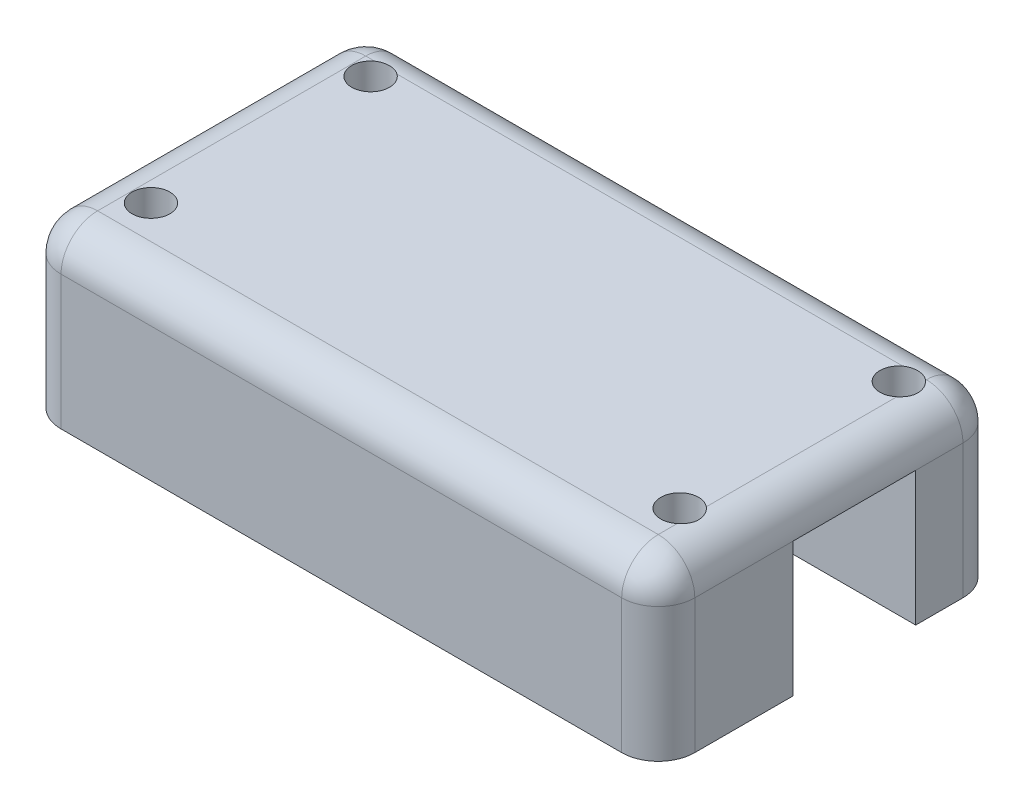
ISO-10303-21;
HEADER;
FILE_DESCRIPTION(('STEP AP214'),'2;1');
FILE_NAME('part.step','',(''),(''),'','','');
FILE_SCHEMA(('AUTOMOTIVE_DESIGN { 1 0 10303 214 1 1 1 1 }'));
ENDSEC;
DATA;
#1=APPLICATION_CONTEXT('core data for automotive mechanical design processes');
#2=APPLICATION_PROTOCOL_DEFINITION('international standard','automotive_design',2000,#1);
#3=PRODUCT_CONTEXT('',#1,'mechanical');
#4=PRODUCT('Part','Part','',(#3));
#5=PRODUCT_RELATED_PRODUCT_CATEGORY('part','',(#4));
#6=PRODUCT_DEFINITION_FORMATION('','',#4);
#7=PRODUCT_DEFINITION_CONTEXT('part definition',#1,'design');
#8=PRODUCT_DEFINITION('design','',#6,#7);
#9=PRODUCT_DEFINITION_SHAPE('','',#8);
#10=(LENGTH_UNIT() NAMED_UNIT(*) SI_UNIT(.MILLI.,.METRE.));
#11=(NAMED_UNIT(*) PLANE_ANGLE_UNIT() SI_UNIT($,.RADIAN.));
#12=(NAMED_UNIT(*) SI_UNIT($,.STERADIAN.) SOLID_ANGLE_UNIT());
#13=UNCERTAINTY_MEASURE_WITH_UNIT(LENGTH_MEASURE(1.E-05),#10,'distance_accuracy_value','');
#14=(GEOMETRIC_REPRESENTATION_CONTEXT(3) GLOBAL_UNCERTAINTY_ASSIGNED_CONTEXT((#13)) GLOBAL_UNIT_ASSIGNED_CONTEXT((#10,
#11,#12)) REPRESENTATION_CONTEXT('',''));
#15=CARTESIAN_POINT('',(0.,0.,0.));
#16=DIRECTION('',(0.,0.,1.));
#17=DIRECTION('',(1.,0.,0.));
#18=AXIS2_PLACEMENT_3D('',#15,#16,#17);
#19=CARTESIAN_POINT('',(26.,14.,-14.));
#20=DIRECTION('',(-1.,0.,0.));
#21=DIRECTION('',(0.,0.,1.));
#22=AXIS2_PLACEMENT_3D('',#19,#20,#21);
#23=PLANE('',#22);
#24=DIRECTION('',(0.,0.,-1.));
#25=VECTOR('',#24,1.);
#26=CARTESIAN_POINT('',(26.,0.,-14.));
#27=LINE('',#26,#25);
#28=CARTESIAN_POINT('',(26.,0.,-7.12499999999999));
#29=VERTEX_POINT('',#28);
#30=CARTESIAN_POINT('',(26.,0.,-11.));
#31=VERTEX_POINT('',#30);
#32=EDGE_CURVE('E182',#29,#31,#27,.T.);
#33=ORIENTED_EDGE('',*,*,#32,.T.);
#34=DIRECTION('',(0.,-1.,0.));
#35=VECTOR('',#34,1.);
#36=CARTESIAN_POINT('',(26.,14.,-11.));
#37=LINE('',#36,#35);
#38=CARTESIAN_POINT('',(26.,11.,-11.));
#39=VERTEX_POINT('',#38);
#40=EDGE_CURVE('E51',#31,#39,#37,.F.);
#41=ORIENTED_EDGE('',*,*,#40,.T.);
#42=DIRECTION('',(0.,0.,-1.));
#43=VECTOR('',#42,1.);
#44=CARTESIAN_POINT('',(26.,11.,14.));
#45=LINE('',#44,#43);
#46=CARTESIAN_POINT('',(26.,11.,-7.12499999999999));
#47=VERTEX_POINT('',#46);
#48=EDGE_CURVE('E495',#39,#47,#45,.F.);
#49=ORIENTED_EDGE('',*,*,#48,.T.);
#50=DIRECTION('',(0.,-1.,0.));
#51=VECTOR('',#50,1.);
#52=CARTESIAN_POINT('',(26.,14.,-7.12499999999999));
#53=LINE('',#52,#51);
#54=EDGE_CURVE('E193',#47,#29,#53,.T.);
#55=ORIENTED_EDGE('',*,*,#54,.T.);
#56=EDGE_LOOP('',(#33,#41,#49,#55));
#57=FACE_BOUND('',#56,.T.);
#58=ADVANCED_FACE('F41',(#57),#23,.F.);
#59=CARTESIAN_POINT('',(-26.,14.,-14.));
#60=DIRECTION('',(1.,0.,0.));
#61=DIRECTION('',(0.,0.,-1.));
#62=AXIS2_PLACEMENT_3D('',#59,#60,#61);
#63=PLANE('',#62);
#64=DIRECTION('',(0.,0.,1.));
#65=VECTOR('',#64,1.);
#66=CARTESIAN_POINT('',(-26.,0.,-14.));
#67=LINE('',#66,#65);
#68=CARTESIAN_POINT('',(-26.,0.,2.925));
#69=VERTEX_POINT('',#68);
#70=CARTESIAN_POINT('',(-26.,0.,11.));
#71=VERTEX_POINT('',#70);
#72=EDGE_CURVE('E201',#69,#71,#67,.T.);
#73=ORIENTED_EDGE('',*,*,#72,.T.);
#74=DIRECTION('',(0.,-1.,0.));
#75=VECTOR('',#74,1.);
#76=CARTESIAN_POINT('',(-26.,14.,11.));
#77=LINE('',#76,#75);
#78=CARTESIAN_POINT('',(-26.,11.,11.));
#79=VERTEX_POINT('',#78);
#80=EDGE_CURVE('E448',#71,#79,#77,.F.);
#81=ORIENTED_EDGE('',*,*,#80,.T.);
#82=DIRECTION('',(0.,0.,1.));
#83=VECTOR('',#82,1.);
#84=CARTESIAN_POINT('',(-26.,11.,-14.));
#85=LINE('',#84,#83);
#86=CARTESIAN_POINT('',(-26.,11.,2.925));
#87=VERTEX_POINT('',#86);
#88=EDGE_CURVE('E305',#79,#87,#85,.F.);
#89=ORIENTED_EDGE('',*,*,#88,.T.);
#90=DIRECTION('',(0.,-1.,0.));
#91=VECTOR('',#90,1.);
#92=CARTESIAN_POINT('',(-26.,14.,2.92500000000001));
#93=LINE('',#92,#91);
#94=EDGE_CURVE('E266',#87,#69,#93,.T.);
#95=ORIENTED_EDGE('',*,*,#94,.T.);
#96=EDGE_LOOP('',(#73,#81,#89,#95));
#97=FACE_BOUND('',#96,.T.);
#98=ADVANCED_FACE('F381',(#97),#63,.F.);
#99=CARTESIAN_POINT('',(0.,14.,0.));
#100=DIRECTION('',(0.,1.,0.));
#101=DIRECTION('',(0.,0.,1.));
#102=AXIS2_PLACEMENT_3D('',#99,#100,#101);
#103=PLANE('',#102);
#104=CARTESIAN_POINT('',(-21.3724903036261,14.,8.24998775653111));
#105=DIRECTION('',(0.,1.,0.));
#106=DIRECTION('',(0.,0.,1.));
#107=AXIS2_PLACEMENT_3D('',#104,#105,#106);
#108=CIRCLE('',#107,1.55);
#109=CARTESIAN_POINT('',(-21.3724903036261,14.,9.79998775653111));
#110=VERTEX_POINT('',#109);
#111=EDGE_CURVE('E247',#110,#110,#108,.T.);
#112=ORIENTED_EDGE('',*,*,#111,.F.);
#113=EDGE_LOOP('',(#112));
#114=FACE_BOUND('',#113,.T.);
#115=CARTESIAN_POINT('',(21.9892542467683,14.,-9.74999999999796));
#116=DIRECTION('',(0.,1.,0.));
#117=DIRECTION('',(0.,0.,1.));
#118=AXIS2_PLACEMENT_3D('',#115,#116,#117);
#119=CIRCLE('',#118,1.55);
#120=CARTESIAN_POINT('',(21.0727391077799,14.,-11.));
#121=VERTEX_POINT('',#120);
#122=CARTESIAN_POINT('',(23.,14.,-8.57488595347992));
#123=VERTEX_POINT('',#122);
#124=EDGE_CURVE('E222',#121,#123,#119,.T.);
#125=ORIENTED_EDGE('',*,*,#124,.F.);
#126=DIRECTION('',(-1.,0.,0.));
#127=VECTOR('',#126,1.);
#128=CARTESIAN_POINT('',(-26.,14.,-11.));
#129=LINE('',#128,#127);
#130=CARTESIAN_POINT('',(-20.4349807652959,14.,-11.));
#131=VERTEX_POINT('',#130);
#132=EDGE_CURVE('E298',#121,#131,#129,.T.);
#133=ORIENTED_EDGE('',*,*,#132,.T.);
#134=CARTESIAN_POINT('',(-21.3514959042843,14.,-9.74999999999796));
#135=DIRECTION('',(0.,1.,0.));
#136=DIRECTION('',(0.,0.,1.));
#137=AXIS2_PLACEMENT_3D('',#134,#135,#136);
#138=CIRCLE('',#137,1.55);
#139=CARTESIAN_POINT('',(-22.2680110432727,14.,-11.));
#140=VERTEX_POINT('',#139);
#141=EDGE_CURVE('E230',#140,#131,#138,.T.);
#142=ORIENTED_EDGE('',*,*,#141,.F.);
#143=DIRECTION('',(-1.,0.,0.));
#144=VECTOR('',#143,1.);
#145=CARTESIAN_POINT('',(-26.,14.,-11.));
#146=LINE('',#145,#144);
#147=CARTESIAN_POINT('',(-23.,14.,-11.));
#148=VERTEX_POINT('',#147);
#149=EDGE_CURVE('E284',#140,#148,#146,.T.);
#150=ORIENTED_EDGE('',*,*,#149,.T.);
#151=DIRECTION('',(0.,0.,1.));
#152=VECTOR('',#151,1.);
#153=CARTESIAN_POINT('',(-23.,14.,14.));
#154=LINE('',#153,#152);
#155=CARTESIAN_POINT('',(-23.,14.,11.));
#156=VERTEX_POINT('',#155);
#157=EDGE_CURVE('E280',#148,#156,#154,.T.);
#158=ORIENTED_EDGE('',*,*,#157,.T.);
#159=DIRECTION('',(1.,0.,0.));
#160=VECTOR('',#159,1.);
#161=CARTESIAN_POINT('',(26.,14.,11.));
#162=LINE('',#161,#160);
#163=CARTESIAN_POINT('',(23.,14.,11.));
#164=VERTEX_POINT('',#163);
#165=EDGE_CURVE('E273',#156,#164,#162,.T.);
#166=ORIENTED_EDGE('',*,*,#165,.T.);
#167=DIRECTION('',(0.,0.,-1.));
#168=VECTOR('',#167,1.);
#169=CARTESIAN_POINT('',(23.,14.,-14.));
#170=LINE('',#169,#168);
#171=CARTESIAN_POINT('',(23.,14.,9.44283823227111));
#172=VERTEX_POINT('',#171);
#173=EDGE_CURVE('E277',#164,#172,#170,.T.);
#174=ORIENTED_EDGE('',*,*,#173,.T.);
#175=CARTESIAN_POINT('',(22.0102486461101,14.,8.24998775653111));
#176=DIRECTION('',(0.,1.,0.));
#177=DIRECTION('',(0.,0.,1.));
#178=AXIS2_PLACEMENT_3D('',#175,#176,#177);
#179=CIRCLE('',#178,1.55);
#180=CARTESIAN_POINT('',(23.,14.,7.05713728079111));
#181=VERTEX_POINT('',#180);
#182=EDGE_CURVE('E239',#181,#172,#179,.T.);
#183=ORIENTED_EDGE('',*,*,#182,.F.);
#184=DIRECTION('',(0.,0.,-1.));
#185=VECTOR('',#184,1.);
#186=CARTESIAN_POINT('',(23.,14.,-14.));
#187=LINE('',#186,#185);
#188=EDGE_CURVE('E295',#181,#123,#187,.T.);
#189=ORIENTED_EDGE('',*,*,#188,.T.);
#190=EDGE_LOOP('',(#125,#133,#142,#150,#158,#166,#174,#183,#189));
#191=FACE_BOUND('',#190,.T.);
#192=ADVANCED_FACE('F370',(#114,#191),#103,.T.);
#193=CARTESIAN_POINT('',(0.,0.,0.));
#194=DIRECTION('',(0.,1.,0.));
#195=DIRECTION('',(0.,0.,1.));
#196=AXIS2_PLACEMENT_3D('',#193,#194,#195);
#197=PLANE('',#196);
#198=CARTESIAN_POINT('',(21.9892542467683,0.,-9.74999999999796));
#199=DIRECTION('',(0.,1.,0.));
#200=DIRECTION('',(0.,0.,1.));
#201=AXIS2_PLACEMENT_3D('',#198,#199,#200);
#202=CIRCLE('',#201,1.55);
#203=CARTESIAN_POINT('',(21.9892542467683,0.,-8.19999999999796));
#204=VERTEX_POINT('',#203);
#205=EDGE_CURVE('E221',#204,#204,#202,.T.);
#206=ORIENTED_EDGE('',*,*,#205,.T.);
#207=EDGE_LOOP('',(#206));
#208=FACE_BOUND('',#207,.T.);
#209=CARTESIAN_POINT('',(-21.3514959042843,0.,-9.74999999999796));
#210=DIRECTION('',(0.,1.,0.));
#211=DIRECTION('',(0.,0.,1.));
#212=AXIS2_PLACEMENT_3D('',#209,#210,#211);
#213=CIRCLE('',#212,1.55);
#214=CARTESIAN_POINT('',(-21.3514959042843,0.,-8.19999999999796));
#215=VERTEX_POINT('',#214);
#216=EDGE_CURVE('E235',#215,#215,#213,.T.);
#217=ORIENTED_EDGE('',*,*,#216,.T.);
#218=EDGE_LOOP('',(#217));
#219=FACE_BOUND('',#218,.T.);
#220=CARTESIAN_POINT('',(-26.,0.,-11.));
#221=VERTEX_POINT('',#220);
#222=CARTESIAN_POINT('',(-26.,0.,-7.12499999999999));
#223=VERTEX_POINT('',#222);
#224=EDGE_CURVE('E256',#221,#223,#67,.T.);
#225=ORIENTED_EDGE('',*,*,#224,.F.);
#226=CARTESIAN_POINT('',(-23.,0.,-11.));
#227=DIRECTION('',(0.,1.,0.));
#228=DIRECTION('',(0.,0.,1.));
#229=AXIS2_PLACEMENT_3D('',#226,#227,#228);
#230=CIRCLE('',#229,3.);
#231=CARTESIAN_POINT('',(-23.,0.,-14.));
#232=VERTEX_POINT('',#231);
#233=EDGE_CURVE('E59',#221,#232,#230,.F.);
#234=ORIENTED_EDGE('',*,*,#233,.T.);
#235=DIRECTION('',(-1.,0.,0.));
#236=VECTOR('',#235,1.);
#237=CARTESIAN_POINT('',(-26.,0.,-14.));
#238=LINE('',#237,#236);
#239=CARTESIAN_POINT('',(23.,0.,-14.));
#240=VERTEX_POINT('',#239);
#241=EDGE_CURVE('E181',#240,#232,#238,.T.);
#242=ORIENTED_EDGE('',*,*,#241,.F.);
#243=CARTESIAN_POINT('',(23.,0.,-11.));
#244=DIRECTION('',(0.,1.,0.));
#245=DIRECTION('',(0.,0.,1.));
#246=AXIS2_PLACEMENT_3D('',#243,#244,#245);
#247=CIRCLE('',#246,3.);
#248=EDGE_CURVE('E415',#240,#31,#247,.F.);
#249=ORIENTED_EDGE('',*,*,#248,.T.);
#250=ORIENTED_EDGE('',*,*,#32,.F.);
#251=DIRECTION('',(1.,0.,0.));
#252=VECTOR('',#251,1.);
#253=CARTESIAN_POINT('',(-31.3177772836356,0.,-7.12499999999999));
#254=LINE('',#253,#252);
#255=EDGE_CURVE('E203',#223,#29,#254,.T.);
#256=ORIENTED_EDGE('',*,*,#255,.F.);
#257=EDGE_LOOP('',(#225,#234,#242,#249,#250,#256));
#258=FACE_BOUND('',#257,.T.);
#259=ADVANCED_FACE('F368',(#208,#219,#258),#197,.F.);
#260=DIRECTION('',(0.,0.,-1.));
#261=VECTOR('',#260,1.);
#262=CARTESIAN_POINT('',(23.,14.,-14.));
#263=LINE('',#262,#261);
#264=CARTESIAN_POINT('',(23.,14.,-10.925114046516));
#265=VERTEX_POINT('',#264);
#266=CARTESIAN_POINT('',(23.,14.,-11.));
#267=VERTEX_POINT('',#266);
#268=EDGE_CURVE('E288',#265,#267,#263,.T.);
#269=ORIENTED_EDGE('',*,*,#268,.T.);
#270=DIRECTION('',(-1.,0.,0.));
#271=VECTOR('',#270,1.);
#272=CARTESIAN_POINT('',(-26.,14.,-11.));
#273=LINE('',#272,#271);
#274=CARTESIAN_POINT('',(22.9057693857566,14.,-11.));
#275=VERTEX_POINT('',#274);
#276=EDGE_CURVE('E292',#267,#275,#273,.T.);
#277=ORIENTED_EDGE('',*,*,#276,.T.);
#278=EDGE_CURVE('E226',#265,#275,#119,.T.);
#279=ORIENTED_EDGE('',*,*,#278,.F.);
#280=EDGE_LOOP('',(#269,#277,#279));
#281=FACE_BOUND('',#280,.T.);
#282=ADVANCED_FACE('F365',(#281),#103,.T.);
#283=DIRECTION('',(1.,0.,0.));
#284=VECTOR('',#283,1.);
#285=CARTESIAN_POINT('',(-26.,0.,14.));
#286=LINE('',#285,#284);
#287=CARTESIAN_POINT('',(-23.,0.,14.));
#288=VERTEX_POINT('',#287);
#289=CARTESIAN_POINT('',(23.,0.,14.));
#290=VERTEX_POINT('',#289);
#291=EDGE_CURVE('E259',#288,#290,#286,.T.);
#292=ORIENTED_EDGE('',*,*,#291,.F.);
#293=CARTESIAN_POINT('',(-23.,0.,11.));
#294=DIRECTION('',(0.,1.,0.));
#295=DIRECTION('',(0.,0.,1.));
#296=AXIS2_PLACEMENT_3D('',#293,#294,#295);
#297=CIRCLE('',#296,3.);
#298=EDGE_CURVE('E443',#288,#71,#297,.F.);
#299=ORIENTED_EDGE('',*,*,#298,.T.);
#300=ORIENTED_EDGE('',*,*,#72,.F.);
#301=DIRECTION('',(-1.,0.,0.));
#302=VECTOR('',#301,1.);
#303=CARTESIAN_POINT('',(-31.3177772836356,0.,2.925));
#304=LINE('',#303,#302);
#305=CARTESIAN_POINT('',(26.,0.,2.925));
#306=VERTEX_POINT('',#305);
#307=EDGE_CURVE('E188',#306,#69,#304,.T.);
#308=ORIENTED_EDGE('',*,*,#307,.F.);
#309=CARTESIAN_POINT('',(26.,0.,11.));
#310=VERTEX_POINT('',#309);
#311=EDGE_CURVE('E170',#310,#306,#27,.T.);
#312=ORIENTED_EDGE('',*,*,#311,.F.);
#313=CARTESIAN_POINT('',(23.,0.,11.));
#314=DIRECTION('',(0.,1.,0.));
#315=DIRECTION('',(0.,0.,1.));
#316=AXIS2_PLACEMENT_3D('',#313,#314,#315);
#317=CIRCLE('',#316,3.);
#318=EDGE_CURVE('E441',#310,#290,#317,.F.);
#319=ORIENTED_EDGE('',*,*,#318,.T.);
#320=EDGE_LOOP('',(#292,#299,#300,#308,#312,#319));
#321=FACE_BOUND('',#320,.T.);
#322=CARTESIAN_POINT('',(-21.3724903036261,0.,8.24998775653111));
#323=DIRECTION('',(0.,1.,0.));
#324=DIRECTION('',(0.,0.,1.));
#325=AXIS2_PLACEMENT_3D('',#322,#323,#324);
#326=CIRCLE('',#325,1.55);
#327=CARTESIAN_POINT('',(-21.3724903036261,0.,9.79998775653111));
#328=VERTEX_POINT('',#327);
#329=EDGE_CURVE('E243',#328,#328,#326,.T.);
#330=ORIENTED_EDGE('',*,*,#329,.T.);
#331=EDGE_LOOP('',(#330));
#332=FACE_BOUND('',#331,.T.);
#333=CARTESIAN_POINT('',(22.0102486461101,0.,8.24998775653111));
#334=DIRECTION('',(0.,1.,0.));
#335=DIRECTION('',(0.,0.,1.));
#336=AXIS2_PLACEMENT_3D('',#333,#334,#335);
#337=CIRCLE('',#336,1.55);
#338=CARTESIAN_POINT('',(22.0102486461101,0.,9.79998775653111));
#339=VERTEX_POINT('',#338);
#340=EDGE_CURVE('E234',#339,#339,#337,.T.);
#341=ORIENTED_EDGE('',*,*,#340,.T.);
#342=EDGE_LOOP('',(#341));
#343=FACE_BOUND('',#342,.T.);
#344=ADVANCED_FACE('F198',(#321,#332,#343),#197,.F.);
#345=DIRECTION('',(0.,0.,-1.));
#346=VECTOR('',#345,1.);
#347=CARTESIAN_POINT('',(26.,11.,14.));
#348=LINE('',#347,#346);
#349=CARTESIAN_POINT('',(26.,11.,2.925));
#350=VERTEX_POINT('',#349);
#351=CARTESIAN_POINT('',(26.,11.,11.));
#352=VERTEX_POINT('',#351);
#353=EDGE_CURVE('E350',#350,#352,#348,.F.);
#354=ORIENTED_EDGE('',*,*,#353,.T.);
#355=DIRECTION('',(0.,-1.,0.));
#356=VECTOR('',#355,1.);
#357=CARTESIAN_POINT('',(26.,14.,11.));
#358=LINE('',#357,#356);
#359=EDGE_CURVE('E11',#352,#310,#358,.T.);
#360=ORIENTED_EDGE('',*,*,#359,.T.);
#361=ORIENTED_EDGE('',*,*,#311,.T.);
#362=DIRECTION('',(0.,1.,0.));
#363=VECTOR('',#362,1.);
#364=CARTESIAN_POINT('',(26.,14.,2.92500000000001));
#365=LINE('',#364,#363);
#366=EDGE_CURVE('E174',#306,#350,#365,.T.);
#367=ORIENTED_EDGE('',*,*,#366,.T.);
#368=EDGE_LOOP('',(#354,#360,#361,#367));
#369=FACE_BOUND('',#368,.T.);
#370=ADVANCED_FACE('F173',(#369),#23,.F.);
#371=CARTESIAN_POINT('',(-26.,14.,-14.));
#372=DIRECTION('',(0.,0.,1.));
#373=DIRECTION('',(1.,0.,0.));
#374=AXIS2_PLACEMENT_3D('',#371,#372,#373);
#375=PLANE('',#374);
#376=ORIENTED_EDGE('',*,*,#241,.T.);
#377=DIRECTION('',(0.,-1.,0.));
#378=VECTOR('',#377,1.);
#379=CARTESIAN_POINT('',(-23.,14.,-14.));
#380=LINE('',#379,#378);
#381=CARTESIAN_POINT('',(-23.,11.,-14.));
#382=VERTEX_POINT('',#381);
#383=EDGE_CURVE('E418',#232,#382,#380,.F.);
#384=ORIENTED_EDGE('',*,*,#383,.T.);
#385=DIRECTION('',(-1.,0.,0.));
#386=VECTOR('',#385,1.);
#387=CARTESIAN_POINT('',(26.,11.,-14.));
#388=LINE('',#387,#386);
#389=CARTESIAN_POINT('',(23.,11.,-14.));
#390=VERTEX_POINT('',#389);
#391=EDGE_CURVE('E351',#382,#390,#388,.F.);
#392=ORIENTED_EDGE('',*,*,#391,.T.);
#393=DIRECTION('',(0.,-1.,0.));
#394=VECTOR('',#393,1.);
#395=CARTESIAN_POINT('',(23.,14.,-14.));
#396=LINE('',#395,#394);
#397=EDGE_CURVE('E66',#390,#240,#396,.T.);
#398=ORIENTED_EDGE('',*,*,#397,.T.);
#399=EDGE_LOOP('',(#376,#384,#392,#398));
#400=FACE_BOUND('',#399,.T.);
#401=ADVANCED_FACE('F379',(#400),#375,.F.);
#402=DIRECTION('',(0.,0.,1.));
#403=VECTOR('',#402,1.);
#404=CARTESIAN_POINT('',(-26.,11.,-14.));
#405=LINE('',#404,#403);
#406=CARTESIAN_POINT('',(-26.,11.,-7.12499999999999));
#407=VERTEX_POINT('',#406);
#408=CARTESIAN_POINT('',(-26.,11.,-11.));
#409=VERTEX_POINT('',#408);
#410=EDGE_CURVE('E301',#407,#409,#405,.F.);
#411=ORIENTED_EDGE('',*,*,#410,.T.);
#412=DIRECTION('',(0.,-1.,0.));
#413=VECTOR('',#412,1.);
#414=CARTESIAN_POINT('',(-26.,14.,-11.));
#415=LINE('',#414,#413);
#416=EDGE_CURVE('E455',#409,#221,#415,.T.);
#417=ORIENTED_EDGE('',*,*,#416,.T.);
#418=ORIENTED_EDGE('',*,*,#224,.T.);
#419=DIRECTION('',(0.,1.,0.));
#420=VECTOR('',#419,1.);
#421=CARTESIAN_POINT('',(-26.,14.,-7.12499999999999));
#422=LINE('',#421,#420);
#423=EDGE_CURVE('E269',#223,#407,#422,.T.);
#424=ORIENTED_EDGE('',*,*,#423,.T.);
#425=EDGE_LOOP('',(#411,#417,#418,#424));
#426=FACE_BOUND('',#425,.T.);
#427=ADVANCED_FACE('F375',(#426),#63,.F.);
#428=CARTESIAN_POINT('',(-26.,14.,14.));
#429=DIRECTION('',(0.,0.,-1.));
#430=DIRECTION('',(-1.,0.,0.));
#431=AXIS2_PLACEMENT_3D('',#428,#429,#430);
#432=PLANE('',#431);
#433=DIRECTION('',(1.,0.,0.));
#434=VECTOR('',#433,1.);
#435=CARTESIAN_POINT('',(-26.,11.,14.));
#436=LINE('',#435,#434);
#437=CARTESIAN_POINT('',(23.,11.,14.));
#438=VERTEX_POINT('',#437);
#439=CARTESIAN_POINT('',(-23.,11.,14.));
#440=VERTEX_POINT('',#439);
#441=EDGE_CURVE('E492',#438,#440,#436,.F.);
#442=ORIENTED_EDGE('',*,*,#441,.T.);
#443=DIRECTION('',(0.,-1.,0.));
#444=VECTOR('',#443,1.);
#445=CARTESIAN_POINT('',(-23.,14.,14.));
#446=LINE('',#445,#444);
#447=EDGE_CURVE('E444',#440,#288,#446,.T.);
#448=ORIENTED_EDGE('',*,*,#447,.T.);
#449=ORIENTED_EDGE('',*,*,#291,.T.);
#450=DIRECTION('',(0.,-1.,0.));
#451=VECTOR('',#450,1.);
#452=CARTESIAN_POINT('',(23.,14.,14.));
#453=LINE('',#452,#451);
#454=EDGE_CURVE('E440',#290,#438,#453,.F.);
#455=ORIENTED_EDGE('',*,*,#454,.T.);
#456=EDGE_LOOP('',(#442,#448,#449,#455));
#457=FACE_BOUND('',#456,.T.);
#458=ADVANCED_FACE('F363',(#457),#432,.F.);
#459=CARTESIAN_POINT('',(-21.3724903036261,14.,8.24998775653111));
#460=DIRECTION('',(0.,-1.,0.));
#461=DIRECTION('',(0.,0.,-1.));
#462=AXIS2_PLACEMENT_3D('',#459,#460,#461);
#463=CYLINDRICAL_SURFACE('',#462,1.55);
#464=ORIENTED_EDGE('',*,*,#111,.T.);
#465=EDGE_LOOP('',(#464));
#466=FACE_BOUND('',#465,.T.);
#467=ORIENTED_EDGE('',*,*,#329,.F.);
#468=EDGE_LOOP('',(#467));
#469=FACE_BOUND('',#468,.T.);
#470=ADVANCED_FACE('F358',(#466,#469),#463,.F.);
#471=CARTESIAN_POINT('',(22.0102486461101,14.,8.24998775653111));
#472=DIRECTION('',(0.,-1.,0.));
#473=DIRECTION('',(0.,0.,-1.));
#474=AXIS2_PLACEMENT_3D('',#471,#472,#473);
#475=CYLINDRICAL_SURFACE('',#474,1.55);
#476=ORIENTED_EDGE('',*,*,#182,.T.);
#477=CARTESIAN_POINT('',(23.,14.,9.44283823227111));
#478=CARTESIAN_POINT('',(23.0333823202072,14.0000005997511,9.41514031788999));
#479=CARTESIAN_POINT('',(23.0655805591099,13.9994427920822,9.38605635202186));
#480=CARTESIAN_POINT('',(23.1274073434531,13.997452710743,9.32531793725809));
#481=CARTESIAN_POINT('',(23.1570366247983,13.996020688452,9.29366422955632));
#482=CARTESIAN_POINT('',(23.2417018971786,13.9907818979231,9.19523586607979));
#483=CARTESIAN_POINT('',(23.292628628099,13.9860307795236,9.12489970071304));
#484=CARTESIAN_POINT('',(23.3819968148962,13.9759219630322,8.97682602784743));
#485=CARTESIAN_POINT('',(23.4204422727141,13.9705644601132,8.89909090307733));
#486=CARTESIAN_POINT('',(23.4838733427214,13.9608951634616,8.73824641744766));
#487=CARTESIAN_POINT('',(23.5088613591784,13.9565831830146,8.65513801953517));
#488=CARTESIAN_POINT('',(23.5447747064312,13.9501799873908,8.48520425104248));
#489=CARTESIAN_POINT('',(23.5555951489511,13.9481053558987,8.39835601973506));
#490=CARTESIAN_POINT('',(23.5624833505172,13.9467992632534,8.2240558633282));
#491=CARTESIAN_POINT('',(23.5585519334877,13.9475676433116,8.13660397221683));
#492=CARTESIAN_POINT('',(23.5362590472184,13.9517025748341,7.96512868049261));
#493=CARTESIAN_POINT('',(23.5181406845368,13.9550253372596,7.88107237813902));
#494=CARTESIAN_POINT('',(23.4682981070483,13.9633307269702,7.71713208656688));
#495=CARTESIAN_POINT('',(23.4365658820388,13.968314331085,7.63725058483222));
#496=CARTESIAN_POINT('',(23.3599040701133,13.9785870284896,7.48287815405106));
#497=CARTESIAN_POINT('',(23.3148141470733,13.9838791664755,7.40846728362631));
#498=CARTESIAN_POINT('',(23.2128221817176,13.9928758046604,7.26825455710877));
#499=CARTESIAN_POINT('',(23.1559450049892,13.9965835974666,7.2024350461402));
#500=CARTESIAN_POINT('',(23.0789408636746,13.9989994163861,7.12711377755953));
#501=CARTESIAN_POINT('',(23.0635447881154,13.9993680465515,7.11265989199348));
#502=CARTESIAN_POINT('',(23.0321919789798,13.9998681110024,7.08440851775601));
#503=CARTESIAN_POINT('',(23.0162359496447,13.9999998330606,7.07061025257368));
#504=CARTESIAN_POINT('',(23.,14.,7.0571372807911));
#505=B_SPLINE_CURVE_WITH_KNOTS('',3,(#477,#478,#479,#480,#481,#482,#483,#484,#485,#486,#487,
#488,#489,#490,#491,#492,#493,#494,#495,#496,#497,#498,#499,#500,#501,#502,#503,#504),
.UNSPECIFIED.,.F.,.F.,(4,2,2,2,2,2,2,2,2,2,2,2,2,4),(0.,0.130040082057527,0.260042788848824,
0.519611764895905,0.779097431487643,1.03853672372931,1.29988608818022,1.56122085590164,
1.81817287914782,2.07527629709889,2.33560029147522,2.59538061433883,2.65873170125435,
2.72200578337122),.UNSPECIFIED.);
#506=EDGE_CURVE('E341',#172,#181,#505,.T.);
#507=ORIENTED_EDGE('',*,*,#506,.T.);
#508=EDGE_LOOP('',(#476,#507));
#509=FACE_BOUND('',#508,.T.);
#510=ORIENTED_EDGE('',*,*,#340,.F.);
#511=EDGE_LOOP('',(#510));
#512=FACE_BOUND('',#511,.T.);
#513=ADVANCED_FACE('F353',(#509,#512),#475,.F.);
#514=CARTESIAN_POINT('',(-21.3514959042843,14.,-9.74999999999796));
#515=DIRECTION('',(0.,-1.,0.));
#516=DIRECTION('',(0.,0.,-1.));
#517=AXIS2_PLACEMENT_3D('',#514,#515,#516);
#518=CYLINDRICAL_SURFACE('',#517,1.55);
#519=ORIENTED_EDGE('',*,*,#141,.T.);
#520=CARTESIAN_POINT('',(-20.4349807652959,14.,-11.));
#521=CARTESIAN_POINT('',(-20.4701102873341,13.9999981694648,-11.0257571686716));
#522=CARTESIAN_POINT('',(-20.5063071117784,13.9996686518919,-11.0500189698956));
#523=CARTESIAN_POINT('',(-20.5806040463201,13.9985686748286,-11.0954079012873));
#524=CARTESIAN_POINT('',(-20.6187039480046,13.9977982635259,-11.1165353737052));
#525=CARTESIAN_POINT('',(-20.7354268370393,13.9951493122719,-11.1749601487674));
#526=CARTESIAN_POINT('',(-20.8165611251105,13.9929319881688,-11.2073642772467));
#527=CARTESIAN_POINT('',(-20.9831102620672,13.9889855721046,-11.2581057062889));
#528=CARTESIAN_POINT('',(-21.0685264242353,13.9872566310263,-11.2764386626489));
#529=CARTESIAN_POINT('',(-21.2412224801898,13.9851318815302,-11.298518251521));
#530=CARTESIAN_POINT('',(-21.3285016457464,13.9847355614708,-11.3022704821894));
#531=CARTESIAN_POINT('',(-21.5022822313397,13.9854533135555,-11.2950943974034));
#532=CARTESIAN_POINT('',(-21.5887847602251,13.9865646952349,-11.2841922327526));
#533=CARTESIAN_POINT('',(-21.7587460661302,13.9897807414126,-11.2480626137892));
#534=CARTESIAN_POINT('',(-21.8422047836319,13.9918854253225,-11.2228348795172));
#535=CARTESIAN_POINT('',(-21.984235609716,13.9954741361205,-11.1665072477122));
#536=CARTESIAN_POINT('',(-22.0439644373291,13.996985663813,-11.1382802437438));
#537=CARTESIAN_POINT('',(-22.1592870729244,13.9992399134947,-11.0745081374913));
#538=CARTESIAN_POINT('',(-22.2148863102791,13.9999836621413,-11.0389728841365));
#539=CARTESIAN_POINT('',(-22.2680110432727,14.,-11.));
#540=B_SPLINE_CURVE_WITH_KNOTS('',3,(#520,#521,#522,#523,#524,#525,#526,#527,#528,#529,#530,
#531,#532,#533,#534,#535,#536,#537,#538,#539),.UNSPECIFIED.,.F.,.F.,(4,2,2,2,2,2,2,2,2,4),(0.,
0.130596425854915,0.261178580840463,0.522019515080948,0.782940946571529,1.04376218940319,
1.30411861346899,1.56448012576116,1.76220358866241,1.9596623162451),.UNSPECIFIED.);
#541=EDGE_CURVE('E519',#131,#140,#540,.T.);
#542=ORIENTED_EDGE('',*,*,#541,.T.);
#543=EDGE_LOOP('',(#519,#542));
#544=FACE_BOUND('',#543,.T.);
#545=ORIENTED_EDGE('',*,*,#216,.F.);
#546=EDGE_LOOP('',(#545));
#547=FACE_BOUND('',#546,.T.);
#548=ADVANCED_FACE('F357',(#544,#547),#518,.F.);
#549=CARTESIAN_POINT('',(21.9892542467683,14.,-9.74999999999796));
#550=DIRECTION('',(0.,-1.,0.));
#551=DIRECTION('',(0.,0.,-1.));
#552=AXIS2_PLACEMENT_3D('',#549,#550,#551);
#553=CYLINDRICAL_SURFACE('',#552,1.55);
#554=ORIENTED_EDGE('',*,*,#278,.T.);
#555=CARTESIAN_POINT('',(22.9057693857566,14.,-11.));
#556=CARTESIAN_POINT('',(22.8706398637184,13.9999981694648,-11.0257571686716));
#557=CARTESIAN_POINT('',(22.8344430392741,13.9996686518919,-11.0500189698956));
#558=CARTESIAN_POINT('',(22.7601461047324,13.9985686748286,-11.0954079012873));
#559=CARTESIAN_POINT('',(22.7220462030479,13.9977982635259,-11.1165353737052));
#560=CARTESIAN_POINT('',(22.6053233140132,13.9951493122719,-11.1749601487674));
#561=CARTESIAN_POINT('',(22.5241890259421,13.9929319881688,-11.2073642772467));
#562=CARTESIAN_POINT('',(22.3576398889853,13.9889855721046,-11.2581057062889));
#563=CARTESIAN_POINT('',(22.2722237268172,13.9872566310263,-11.2764386626489));
#564=CARTESIAN_POINT('',(22.0995276708627,13.9851318815302,-11.298518251521));
#565=CARTESIAN_POINT('',(22.0122485053061,13.9847355614708,-11.3022704821894));
#566=CARTESIAN_POINT('',(21.8384679197128,13.9854533135555,-11.2950943974034));
#567=CARTESIAN_POINT('',(21.7519653908274,13.9865646952349,-11.2841922327526));
#568=CARTESIAN_POINT('',(21.5820040849223,13.9897807414126,-11.2480626137892));
#569=CARTESIAN_POINT('',(21.4985453674206,13.9918854253225,-11.2228348795172));
#570=CARTESIAN_POINT('',(21.3565145413366,13.9954741361205,-11.1665072477122));
#571=CARTESIAN_POINT('',(21.2967857137235,13.996985663813,-11.1382802437438));
#572=CARTESIAN_POINT('',(21.1814630781282,13.9992399134947,-11.0745081374913));
#573=CARTESIAN_POINT('',(21.1258638407734,13.9999836621413,-11.0389728841365));
#574=CARTESIAN_POINT('',(21.0727391077799,14.,-11.));
#575=B_SPLINE_CURVE_WITH_KNOTS('',3,(#555,#556,#557,#558,#559,#560,#561,#562,#563,#564,#565,
#566,#567,#568,#569,#570,#571,#572,#573,#574),.UNSPECIFIED.,.F.,.F.,(4,2,2,2,2,2,2,2,2,4),(0.,
0.130596425854915,0.261178580840463,0.522019515080948,0.782940946571529,1.04376218940319,
1.30411861346899,1.56448012576116,1.76220358866241,1.9596623162451),.UNSPECIFIED.);
#576=EDGE_CURVE('E317',#275,#121,#575,.T.);
#577=ORIENTED_EDGE('',*,*,#576,.T.);
#578=ORIENTED_EDGE('',*,*,#124,.T.);
#579=CARTESIAN_POINT('',(23.,14.,-8.57488595347992));
#580=CARTESIAN_POINT('',(23.0329043767212,14.0000004242935,-8.60318731704167));
#581=CARTESIAN_POINT('',(23.0645991561127,13.9994586615915,-8.63285509016178));
#582=CARTESIAN_POINT('',(23.125372104899,13.9975331611696,-8.69471943872046));
#583=CARTESIAN_POINT('',(23.1544509839289,13.996149652592,-8.72691532387322));
#584=CARTESIAN_POINT('',(23.2374043294865,13.991104806047,-8.82690579208625));
#585=CARTESIAN_POINT('',(23.287102975926,13.9865475814076,-8.89819586656214));
#586=CARTESIAN_POINT('',(23.3738706933601,13.9769341032213,-9.04797641591526));
#587=CARTESIAN_POINT('',(23.4109429992149,13.9718779779212,-9.12646503997809));
#588=CARTESIAN_POINT('',(23.4715058824217,13.9628742468523,-9.28857863593165));
#589=CARTESIAN_POINT('',(23.4949992628719,13.9589264123856,-9.37220254379979));
#590=CARTESIAN_POINT('',(23.5278104877168,13.9532525677924,-9.5427930707426));
#591=CARTESIAN_POINT('',(23.537041666018,13.9515401511388,-9.62977685949743));
#592=CARTESIAN_POINT('',(23.5407608604631,13.9508612003325,-9.80406803856325));
#593=CARTESIAN_POINT('',(23.535249662797,13.9518945197536,-9.89137541137002));
#594=CARTESIAN_POINT('',(23.5098621528029,13.9563828498541,-10.062437032886));
#595=CARTESIAN_POINT('',(23.4902060888064,13.9598007065411,-10.1462251561033));
#596=CARTESIAN_POINT('',(23.4373347856003,13.9680714173446,-10.3093940246918));
#597=CARTESIAN_POINT('',(23.404110038254,13.9729252770692,-10.3887716350326));
#598=CARTESIAN_POINT('',(23.3244919198439,13.9826720402684,-10.541958047504));
#599=CARTESIAN_POINT('',(23.2779291014105,13.9875646030915,-10.6156786297001));
#600=CARTESIAN_POINT('',(23.1731279679897,13.9954570107507,-10.7542154011595));
#601=CARTESIAN_POINT('',(23.1149196433847,13.9984616368908,-10.8190537564657));
#602=CARTESIAN_POINT('',(23.034861083811,13.9998455751376,-10.8944442704988));
#603=CARTESIAN_POINT('',(23.0175987371819,14.00000072449,-10.9099815035353));
#604=CARTESIAN_POINT('',(23.,14.,-10.925114046516));
#605=B_SPLINE_CURVE_WITH_KNOTS('',3,(#579,#580,#581,#582,#583,#584,#585,#586,#587,#588,#589,
#590,#591,#592,#593,#594,#595,#596,#597,#598,#599,#600,#601,#602,#603,#604),.UNSPECIFIED.,.F.,
.F.,(4,2,2,2,2,2,2,2,2,2,2,2,4),(0.,0.130113449055734,0.260191494133164,0.519927373347854,
0.779596658255232,1.03921232045928,1.30039945070731,1.56157265249443,1.81876478456822,
2.07613745187746,2.3369369845972,2.59707333738841,2.66672285436233),.UNSPECIFIED.);
#606=EDGE_CURVE('E308',#123,#265,#605,.T.);
#607=ORIENTED_EDGE('',*,*,#606,.T.);
#608=EDGE_LOOP('',(#554,#577,#578,#607));
#609=FACE_BOUND('',#608,.T.);
#610=ORIENTED_EDGE('',*,*,#205,.F.);
#611=EDGE_LOOP('',(#610));
#612=FACE_BOUND('',#611,.T.);
#613=ADVANCED_FACE('F324',(#609,#612),#553,.F.);
#614=CARTESIAN_POINT('',(-31.3177772836356,11.,-7.12499999999999));
#615=DIRECTION('',(0.,0.,-1.));
#616=DIRECTION('',(-1.,0.,0.));
#617=AXIS2_PLACEMENT_3D('',#614,#615,#616);
#618=PLANE('',#617);
#619=DIRECTION('',(1.,0.,0.));
#620=VECTOR('',#619,1.);
#621=CARTESIAN_POINT('',(-31.3177772836356,11.,-7.12499999999999));
#622=LINE('',#621,#620);
#623=EDGE_CURVE('E213',#407,#47,#622,.T.);
#624=ORIENTED_EDGE('',*,*,#623,.F.);
#625=ORIENTED_EDGE('',*,*,#423,.F.);
#626=ORIENTED_EDGE('',*,*,#255,.T.);
#627=ORIENTED_EDGE('',*,*,#54,.F.);
#628=EDGE_LOOP('',(#624,#625,#626,#627));
#629=FACE_BOUND('',#628,.T.);
#630=ADVANCED_FACE('F550',(#629),#618,.F.);
#631=CARTESIAN_POINT('',(-31.3177772836356,11.,2.925));
#632=DIRECTION('',(0.,0.,1.));
#633=DIRECTION('',(1.,0.,0.));
#634=AXIS2_PLACEMENT_3D('',#631,#632,#633);
#635=PLANE('',#634);
#636=ORIENTED_EDGE('',*,*,#307,.T.);
#637=ORIENTED_EDGE('',*,*,#94,.F.);
#638=DIRECTION('',(-1.,0.,0.));
#639=VECTOR('',#638,1.);
#640=CARTESIAN_POINT('',(-31.3177772836356,11.,2.925));
#641=LINE('',#640,#639);
#642=EDGE_CURVE('E191',#350,#87,#641,.T.);
#643=ORIENTED_EDGE('',*,*,#642,.F.);
#644=ORIENTED_EDGE('',*,*,#366,.F.);
#645=EDGE_LOOP('',(#636,#637,#643,#644));
#646=FACE_BOUND('',#645,.T.);
#647=ADVANCED_FACE('F186',(#646),#635,.F.);
#648=CARTESIAN_POINT('',(0.,11.,0.));
#649=DIRECTION('',(0.,-1.,0.));
#650=DIRECTION('',(0.,0.,-1.));
#651=AXIS2_PLACEMENT_3D('',#648,#649,#650);
#652=PLANE('',#651);
#653=DIRECTION('',(0.,0.,1.));
#654=VECTOR('',#653,1.);
#655=CARTESIAN_POINT('',(26.,11.,-14.));
#656=LINE('',#655,#654);
#657=EDGE_CURVE('E194',#47,#350,#656,.T.);
#658=ORIENTED_EDGE('',*,*,#657,.T.);
#659=ORIENTED_EDGE('',*,*,#642,.T.);
#660=DIRECTION('',(0.,0.,-1.));
#661=VECTOR('',#660,1.);
#662=CARTESIAN_POINT('',(-26.,11.,-14.));
#663=LINE('',#662,#661);
#664=EDGE_CURVE('E263',#87,#407,#663,.T.);
#665=ORIENTED_EDGE('',*,*,#664,.T.);
#666=ORIENTED_EDGE('',*,*,#623,.T.);
#667=EDGE_LOOP('',(#658,#659,#665,#666));
#668=FACE_BOUND('',#667,.T.);
#669=ADVANCED_FACE('F333',(#668),#652,.T.);
#670=CARTESIAN_POINT('',(23.,11.,0.));
#671=DIRECTION('',(0.,0.,1.));
#672=DIRECTION('',(1.,0.,0.));
#673=AXIS2_PLACEMENT_3D('',#670,#671,#672);
#674=CYLINDRICAL_SURFACE('',#673,3.);
#675=ORIENTED_EDGE('',*,*,#48,.F.);
#676=CARTESIAN_POINT('',(23.,11.,-11.));
#677=DIRECTION('',(0.,0.,1.));
#678=DIRECTION('',(1.,0.,0.));
#679=AXIS2_PLACEMENT_3D('',#676,#677,#678);
#680=CIRCLE('',#679,3.);
#681=EDGE_CURVE('E481',#39,#267,#680,.T.);
#682=ORIENTED_EDGE('',*,*,#681,.T.);
#683=ORIENTED_EDGE('',*,*,#268,.F.);
#684=ORIENTED_EDGE('',*,*,#606,.F.);
#685=ORIENTED_EDGE('',*,*,#188,.F.);
#686=ORIENTED_EDGE('',*,*,#506,.F.);
#687=ORIENTED_EDGE('',*,*,#173,.F.);
#688=CARTESIAN_POINT('',(23.,11.,11.));
#689=DIRECTION('',(0.,0.,1.));
#690=DIRECTION('',(1.,0.,0.));
#691=AXIS2_PLACEMENT_3D('',#688,#689,#690);
#692=CIRCLE('',#691,3.);
#693=EDGE_CURVE('E435',#164,#352,#692,.F.);
#694=ORIENTED_EDGE('',*,*,#693,.T.);
#695=ORIENTED_EDGE('',*,*,#353,.F.);
#696=ORIENTED_EDGE('',*,*,#657,.F.);
#697=EDGE_LOOP('',(#675,#682,#683,#684,#685,#686,#687,#694,#695,#696));
#698=FACE_BOUND('',#697,.T.);
#699=ADVANCED_FACE('F328',(#698),#674,.T.);
#700=CARTESIAN_POINT('',(0.,11.,-11.));
#701=DIRECTION('',(1.,0.,0.));
#702=DIRECTION('',(0.,0.,-1.));
#703=AXIS2_PLACEMENT_3D('',#700,#701,#702);
#704=CYLINDRICAL_SURFACE('',#703,3.);
#705=ORIENTED_EDGE('',*,*,#391,.F.);
#706=CARTESIAN_POINT('',(-23.,11.,-11.));
#707=DIRECTION('',(1.,0.,0.));
#708=DIRECTION('',(0.,0.,-1.));
#709=AXIS2_PLACEMENT_3D('',#706,#707,#708);
#710=CIRCLE('',#709,3.);
#711=EDGE_CURVE('E474',#382,#148,#710,.T.);
#712=ORIENTED_EDGE('',*,*,#711,.T.);
#713=ORIENTED_EDGE('',*,*,#149,.F.);
#714=ORIENTED_EDGE('',*,*,#541,.F.);
#715=ORIENTED_EDGE('',*,*,#132,.F.);
#716=ORIENTED_EDGE('',*,*,#576,.F.);
#717=ORIENTED_EDGE('',*,*,#276,.F.);
#718=CARTESIAN_POINT('',(23.,11.,-11.));
#719=DIRECTION('',(1.,0.,0.));
#720=DIRECTION('',(0.,0.,-1.));
#721=AXIS2_PLACEMENT_3D('',#718,#719,#720);
#722=CIRCLE('',#721,3.);
#723=EDGE_CURVE('E477',#267,#390,#722,.F.);
#724=ORIENTED_EDGE('',*,*,#723,.T.);
#725=EDGE_LOOP('',(#705,#712,#713,#714,#715,#716,#717,#724));
#726=FACE_BOUND('',#725,.T.);
#727=ADVANCED_FACE('F332',(#726),#704,.T.);
#728=CARTESIAN_POINT('',(0.,11.,11.));
#729=DIRECTION('',(-1.,0.,0.));
#730=DIRECTION('',(0.,0.,1.));
#731=AXIS2_PLACEMENT_3D('',#728,#729,#730);
#732=CYLINDRICAL_SURFACE('',#731,3.);
#733=ORIENTED_EDGE('',*,*,#165,.F.);
#734=CARTESIAN_POINT('',(-23.,11.,11.));
#735=DIRECTION('',(-1.,0.,0.));
#736=DIRECTION('',(0.,0.,1.));
#737=AXIS2_PLACEMENT_3D('',#734,#735,#736);
#738=CIRCLE('',#737,3.);
#739=EDGE_CURVE('E484',#156,#440,#738,.F.);
#740=ORIENTED_EDGE('',*,*,#739,.T.);
#741=ORIENTED_EDGE('',*,*,#441,.F.);
#742=CARTESIAN_POINT('',(23.,11.,11.));
#743=DIRECTION('',(-1.,0.,0.));
#744=DIRECTION('',(0.,0.,1.));
#745=AXIS2_PLACEMENT_3D('',#742,#743,#744);
#746=CIRCLE('',#745,3.);
#747=EDGE_CURVE('E437',#438,#164,#746,.T.);
#748=ORIENTED_EDGE('',*,*,#747,.T.);
#749=EDGE_LOOP('',(#733,#740,#741,#748));
#750=FACE_BOUND('',#749,.T.);
#751=ADVANCED_FACE('F389',(#750),#732,.T.);
#752=CARTESIAN_POINT('',(-23.,11.,0.));
#753=DIRECTION('',(0.,0.,-1.));
#754=DIRECTION('',(-1.,0.,0.));
#755=AXIS2_PLACEMENT_3D('',#752,#753,#754);
#756=CYLINDRICAL_SURFACE('',#755,3.);
#757=ORIENTED_EDGE('',*,*,#88,.F.);
#758=CARTESIAN_POINT('',(-23.,11.,11.));
#759=DIRECTION('',(0.,0.,-1.));
#760=DIRECTION('',(-1.,0.,0.));
#761=AXIS2_PLACEMENT_3D('',#758,#759,#760);
#762=CIRCLE('',#761,3.);
#763=EDGE_CURVE('E499',#79,#156,#762,.T.);
#764=ORIENTED_EDGE('',*,*,#763,.T.);
#765=ORIENTED_EDGE('',*,*,#157,.F.);
#766=CARTESIAN_POINT('',(-23.,11.,-11.));
#767=DIRECTION('',(0.,0.,-1.));
#768=DIRECTION('',(-1.,0.,0.));
#769=AXIS2_PLACEMENT_3D('',#766,#767,#768);
#770=CIRCLE('',#769,3.);
#771=EDGE_CURVE('E473',#148,#409,#770,.F.);
#772=ORIENTED_EDGE('',*,*,#771,.T.);
#773=ORIENTED_EDGE('',*,*,#410,.F.);
#774=ORIENTED_EDGE('',*,*,#664,.F.);
#775=EDGE_LOOP('',(#757,#764,#765,#772,#773,#774));
#776=FACE_BOUND('',#775,.T.);
#777=ADVANCED_FACE('F386',(#776),#756,.T.);
#778=CARTESIAN_POINT('',(-23.,14.,11.));
#779=DIRECTION('',(0.,-1.,0.));
#780=DIRECTION('',(0.,0.,-1.));
#781=AXIS2_PLACEMENT_3D('',#778,#779,#780);
#782=CYLINDRICAL_SURFACE('',#781,3.);
#783=ORIENTED_EDGE('',*,*,#298,.F.);
#784=ORIENTED_EDGE('',*,*,#447,.F.);
#785=CARTESIAN_POINT('',(-23.,11.,11.));
#786=DIRECTION('',(0.,1.,0.));
#787=DIRECTION('',(0.,0.,1.));
#788=AXIS2_PLACEMENT_3D('',#785,#786,#787);
#789=CIRCLE('',#788,3.);
#790=EDGE_CURVE('E204',#79,#440,#789,.T.);
#791=ORIENTED_EDGE('',*,*,#790,.F.);
#792=ORIENTED_EDGE('',*,*,#80,.F.);
#793=EDGE_LOOP('',(#783,#784,#791,#792));
#794=FACE_BOUND('',#793,.T.);
#795=ADVANCED_FACE('F388',(#794),#782,.T.);
#796=CARTESIAN_POINT('',(-23.,11.,11.));
#797=DIRECTION('',(0.,0.,1.));
#798=DIRECTION('',(1.,0.,0.));
#799=AXIS2_PLACEMENT_3D('',#796,#797,#798);
#800=SPHERICAL_SURFACE('',#799,3.);
#801=ORIENTED_EDGE('',*,*,#790,.T.);
#802=ORIENTED_EDGE('',*,*,#739,.F.);
#803=ORIENTED_EDGE('',*,*,#763,.F.);
#804=EDGE_LOOP('',(#801,#802,#803));
#805=FACE_BOUND('',#804,.T.);
#806=ADVANCED_FACE('F337',(#805),#800,.T.);
#807=CARTESIAN_POINT('',(-23.,14.,-11.));
#808=DIRECTION('',(0.,-1.,0.));
#809=DIRECTION('',(0.,0.,-1.));
#810=AXIS2_PLACEMENT_3D('',#807,#808,#809);
#811=CYLINDRICAL_SURFACE('',#810,3.);
#812=ORIENTED_EDGE('',*,*,#233,.F.);
#813=ORIENTED_EDGE('',*,*,#416,.F.);
#814=CARTESIAN_POINT('',(-23.,11.,-11.));
#815=DIRECTION('',(0.,1.,0.));
#816=DIRECTION('',(0.,0.,1.));
#817=AXIS2_PLACEMENT_3D('',#814,#815,#816);
#818=CIRCLE('',#817,3.);
#819=EDGE_CURVE('E210',#382,#409,#818,.T.);
#820=ORIENTED_EDGE('',*,*,#819,.F.);
#821=ORIENTED_EDGE('',*,*,#383,.F.);
#822=EDGE_LOOP('',(#812,#813,#820,#821));
#823=FACE_BOUND('',#822,.T.);
#824=ADVANCED_FACE('F466',(#823),#811,.T.);
#825=CARTESIAN_POINT('',(-23.,11.,-11.));
#826=DIRECTION('',(0.,0.,1.));
#827=DIRECTION('',(1.,0.,0.));
#828=AXIS2_PLACEMENT_3D('',#825,#826,#827);
#829=SPHERICAL_SURFACE('',#828,3.);
#830=ORIENTED_EDGE('',*,*,#771,.F.);
#831=ORIENTED_EDGE('',*,*,#711,.F.);
#832=ORIENTED_EDGE('',*,*,#819,.T.);
#833=EDGE_LOOP('',(#830,#831,#832));
#834=FACE_BOUND('',#833,.T.);
#835=ADVANCED_FACE('F472',(#834),#829,.T.);
#836=CARTESIAN_POINT('',(23.,14.,-11.));
#837=DIRECTION('',(0.,-1.,0.));
#838=DIRECTION('',(0.,0.,-1.));
#839=AXIS2_PLACEMENT_3D('',#836,#837,#838);
#840=CYLINDRICAL_SURFACE('',#839,3.);
#841=ORIENTED_EDGE('',*,*,#248,.F.);
#842=ORIENTED_EDGE('',*,*,#397,.F.);
#843=CARTESIAN_POINT('',(23.,11.,-11.));
#844=DIRECTION('',(0.,1.,0.));
#845=DIRECTION('',(0.,0.,1.));
#846=AXIS2_PLACEMENT_3D('',#843,#844,#845);
#847=CIRCLE('',#846,3.);
#848=EDGE_CURVE('E416',#39,#390,#847,.T.);
#849=ORIENTED_EDGE('',*,*,#848,.F.);
#850=ORIENTED_EDGE('',*,*,#40,.F.);
#851=EDGE_LOOP('',(#841,#842,#849,#850));
#852=FACE_BOUND('',#851,.T.);
#853=ADVANCED_FACE('F414',(#852),#840,.T.);
#854=CARTESIAN_POINT('',(23.,11.,-11.));
#855=DIRECTION('',(0.,0.,1.));
#856=DIRECTION('',(1.,0.,0.));
#857=AXIS2_PLACEMENT_3D('',#854,#855,#856);
#858=SPHERICAL_SURFACE('',#857,3.);
#859=ORIENTED_EDGE('',*,*,#723,.F.);
#860=ORIENTED_EDGE('',*,*,#681,.F.);
#861=ORIENTED_EDGE('',*,*,#848,.T.);
#862=EDGE_LOOP('',(#859,#860,#861));
#863=FACE_BOUND('',#862,.T.);
#864=ADVANCED_FACE('F555',(#863),#858,.T.);
#865=CARTESIAN_POINT('',(23.,14.,11.));
#866=DIRECTION('',(0.,-1.,0.));
#867=DIRECTION('',(0.,0.,-1.));
#868=AXIS2_PLACEMENT_3D('',#865,#866,#867);
#869=CYLINDRICAL_SURFACE('',#868,3.);
#870=ORIENTED_EDGE('',*,*,#318,.F.);
#871=ORIENTED_EDGE('',*,*,#359,.F.);
#872=CARTESIAN_POINT('',(23.,11.,11.));
#873=DIRECTION('',(0.,1.,0.));
#874=DIRECTION('',(0.,0.,1.));
#875=AXIS2_PLACEMENT_3D('',#872,#873,#874);
#876=CIRCLE('',#875,3.);
#877=EDGE_CURVE('E45',#438,#352,#876,.T.);
#878=ORIENTED_EDGE('',*,*,#877,.F.);
#879=ORIENTED_EDGE('',*,*,#454,.F.);
#880=EDGE_LOOP('',(#870,#871,#878,#879));
#881=FACE_BOUND('',#880,.T.);
#882=ADVANCED_FACE('F43',(#881),#869,.T.);
#883=CARTESIAN_POINT('',(23.,11.,11.));
#884=DIRECTION('',(0.,0.,1.));
#885=DIRECTION('',(1.,0.,0.));
#886=AXIS2_PLACEMENT_3D('',#883,#884,#885);
#887=SPHERICAL_SURFACE('',#886,3.);
#888=ORIENTED_EDGE('',*,*,#877,.T.);
#889=ORIENTED_EDGE('',*,*,#693,.F.);
#890=ORIENTED_EDGE('',*,*,#747,.F.);
#891=EDGE_LOOP('',(#888,#889,#890));
#892=FACE_BOUND('',#891,.T.);
#893=ADVANCED_FACE('F434',(#892),#887,.T.);
#894=CLOSED_SHELL('',(#58,#98,#192,#259,#282,#344,#370,#401,#427,#458,#470,#513,#548,#613,#630,
#647,#669,#699,#727,#751,#777,#795,#806,#824,#835,#853,#864,#882,#893));
#895=MANIFOLD_SOLID_BREP('B2',#894);
#896=ADVANCED_BREP_SHAPE_REPRESENTATION('',(#18,#895),#14);
#897=SHAPE_DEFINITION_REPRESENTATION(#9,#896);
ENDSEC;
END-ISO-10303-21;
